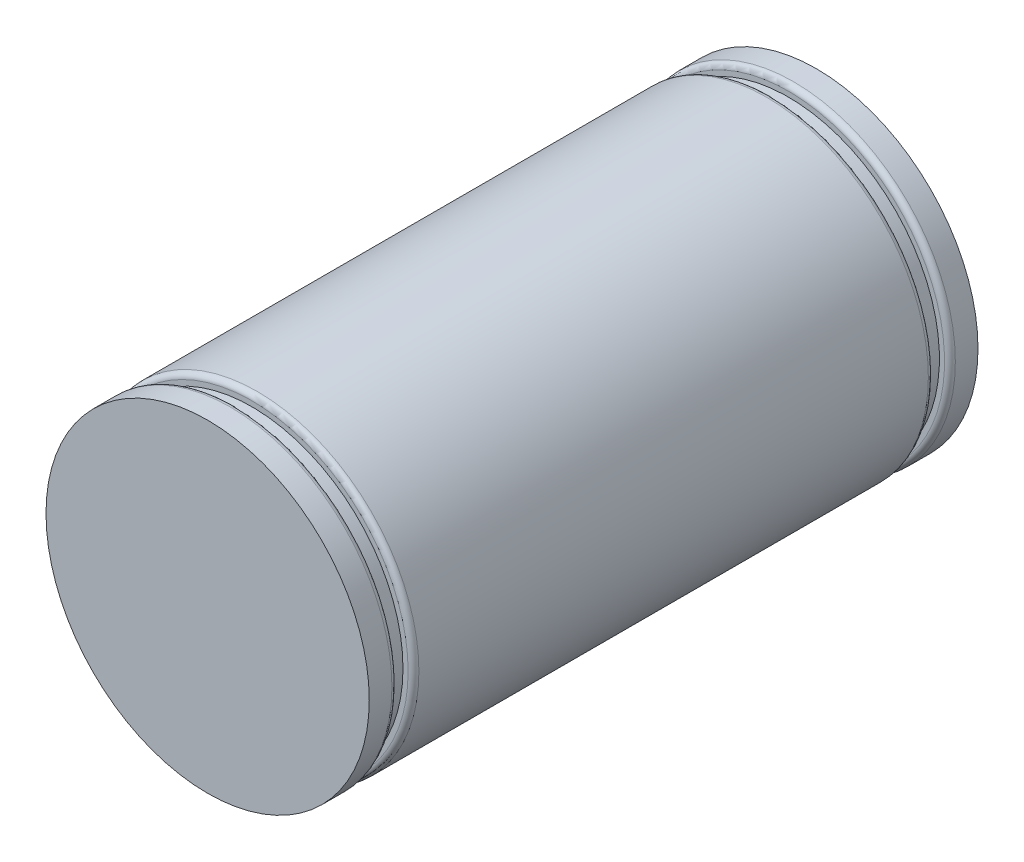
ISO-10303-21;
HEADER;
FILE_DESCRIPTION(('STEP AP214'),'2;1');
FILE_NAME('part.step','',(''),(''),'','','');
FILE_SCHEMA(('AUTOMOTIVE_DESIGN { 1 0 10303 214 1 1 1 1 }'));
ENDSEC;
DATA;
#1=APPLICATION_CONTEXT('core data for automotive mechanical design processes');
#2=APPLICATION_PROTOCOL_DEFINITION('international standard','automotive_design',2000,#1);
#3=PRODUCT_CONTEXT('',#1,'mechanical');
#4=PRODUCT('Part','Part','',(#3));
#5=PRODUCT_RELATED_PRODUCT_CATEGORY('part','',(#4));
#6=PRODUCT_DEFINITION_FORMATION('','',#4);
#7=PRODUCT_DEFINITION_CONTEXT('part definition',#1,'design');
#8=PRODUCT_DEFINITION('design','',#6,#7);
#9=PRODUCT_DEFINITION_SHAPE('','',#8);
#10=(LENGTH_UNIT() NAMED_UNIT(*) SI_UNIT(.MILLI.,.METRE.));
#11=(NAMED_UNIT(*) PLANE_ANGLE_UNIT() SI_UNIT($,.RADIAN.));
#12=(NAMED_UNIT(*) SI_UNIT($,.STERADIAN.) SOLID_ANGLE_UNIT());
#13=UNCERTAINTY_MEASURE_WITH_UNIT(LENGTH_MEASURE(1.E-05),#10,'distance_accuracy_value','');
#14=(GEOMETRIC_REPRESENTATION_CONTEXT(3) GLOBAL_UNCERTAINTY_ASSIGNED_CONTEXT((#13)) GLOBAL_UNIT_ASSIGNED_CONTEXT((#10,
#11,#12)) REPRESENTATION_CONTEXT('',''));
#15=CARTESIAN_POINT('',(0.,0.,0.));
#16=DIRECTION('',(0.,0.,1.));
#17=DIRECTION('',(1.,0.,0.));
#18=AXIS2_PLACEMENT_3D('',#15,#16,#17);
#19=CARTESIAN_POINT('',(0.,0.,-24.1));
#20=DIRECTION('',(0.,0.,1.));
#21=DIRECTION('',(1.,0.,0.));
#22=AXIS2_PLACEMENT_3D('',#19,#20,#21);
#23=CYLINDRICAL_SURFACE('',#22,14.975);
#24=CARTESIAN_POINT('',(0.,0.,-23.6));
#25=DIRECTION('',(0.,0.,1.));
#26=DIRECTION('',(1.,0.,0.));
#27=AXIS2_PLACEMENT_3D('',#24,#25,#26);
#28=CIRCLE('',#27,14.975);
#29=CARTESIAN_POINT('',(14.975,0.,-23.6));
#30=VERTEX_POINT('',#29);
#31=EDGE_CURVE('E48',#30,#30,#28,.T.);
#32=ORIENTED_EDGE('',*,*,#31,.T.);
#33=EDGE_LOOP('',(#32));
#34=FACE_BOUND('',#33,.T.);
#35=CARTESIAN_POINT('',(0.,0.,23.6));
#36=DIRECTION('',(0.,0.,1.));
#37=DIRECTION('',(1.,0.,0.));
#38=AXIS2_PLACEMENT_3D('',#35,#36,#37);
#39=CIRCLE('',#38,14.975);
#40=CARTESIAN_POINT('',(14.975,0.,23.6));
#41=VERTEX_POINT('',#40);
#42=EDGE_CURVE('E52',#41,#41,#39,.F.);
#43=ORIENTED_EDGE('',*,*,#42,.T.);
#44=EDGE_LOOP('',(#43));
#45=FACE_BOUND('',#44,.T.);
#46=ADVANCED_FACE('F37',(#34,#45),#23,.T.);
#47=CARTESIAN_POINT('',(0.,0.,-24.1));
#48=DIRECTION('',(0.,0.,1.));
#49=DIRECTION('',(1.,0.,0.));
#50=AXIS2_PLACEMENT_3D('',#47,#48,#49);
#51=PLANE('',#50);
#52=CARTESIAN_POINT('',(0.,0.,-24.1));
#53=DIRECTION('',(0.,0.,1.));
#54=DIRECTION('',(1.,0.,0.));
#55=AXIS2_PLACEMENT_3D('',#52,#53,#54);
#56=CIRCLE('',#55,14.475);
#57=CARTESIAN_POINT('',(14.475,0.,-24.1));
#58=VERTEX_POINT('',#57);
#59=EDGE_CURVE('E44',#58,#58,#56,.F.);
#60=ORIENTED_EDGE('',*,*,#59,.T.);
#61=EDGE_LOOP('',(#60));
#62=FACE_BOUND('',#61,.T.);
#63=CARTESIAN_POINT('',(0.,0.,-24.1));
#64=DIRECTION('',(0.,0.,-1.));
#65=DIRECTION('',(-1.,0.,0.));
#66=AXIS2_PLACEMENT_3D('',#63,#64,#65);
#67=CIRCLE('',#66,14.);
#68=CARTESIAN_POINT('',(-14.,0.,-24.1));
#69=VERTEX_POINT('',#68);
#70=EDGE_CURVE('E69',#69,#69,#67,.T.);
#71=ORIENTED_EDGE('',*,*,#70,.F.);
#72=EDGE_LOOP('',(#71));
#73=FACE_BOUND('',#72,.T.);
#74=ADVANCED_FACE('F108',(#62,#73),#51,.F.);
#75=CARTESIAN_POINT('',(0.,0.,24.1));
#76=DIRECTION('',(0.,0.,1.));
#77=DIRECTION('',(1.,0.,0.));
#78=AXIS2_PLACEMENT_3D('',#75,#76,#77);
#79=PLANE('',#78);
#80=CARTESIAN_POINT('',(0.,0.,24.1));
#81=DIRECTION('',(0.,0.,1.));
#82=DIRECTION('',(1.,0.,0.));
#83=AXIS2_PLACEMENT_3D('',#80,#81,#82);
#84=CIRCLE('',#83,14.475);
#85=CARTESIAN_POINT('',(14.475,0.,24.1));
#86=VERTEX_POINT('',#85);
#87=EDGE_CURVE('E10',#86,#86,#84,.T.);
#88=ORIENTED_EDGE('',*,*,#87,.T.);
#89=EDGE_LOOP('',(#88));
#90=FACE_BOUND('',#89,.T.);
#91=CARTESIAN_POINT('',(0.,0.,24.1));
#92=DIRECTION('',(0.,0.,1.));
#93=DIRECTION('',(1.,0.,0.));
#94=AXIS2_PLACEMENT_3D('',#91,#92,#93);
#95=CIRCLE('',#94,14.);
#96=CARTESIAN_POINT('',(14.,0.,24.1));
#97=VERTEX_POINT('',#96);
#98=EDGE_CURVE('E70',#97,#97,#95,.T.);
#99=ORIENTED_EDGE('',*,*,#98,.F.);
#100=EDGE_LOOP('',(#99));
#101=FACE_BOUND('',#100,.T.);
#102=ADVANCED_FACE('F115',(#90,#101),#79,.T.);
#103=CARTESIAN_POINT('',(0.,0.,25.6));
#104=DIRECTION('',(0.,0.,-1.));
#105=DIRECTION('',(-1.,0.,0.));
#106=AXIS2_PLACEMENT_3D('',#103,#104,#105);
#107=CYLINDRICAL_SURFACE('',#106,14.);
#108=CARTESIAN_POINT('',(0.,0.,25.6));
#109=DIRECTION('',(0.,0.,1.));
#110=DIRECTION('',(1.,0.,0.));
#111=AXIS2_PLACEMENT_3D('',#108,#109,#110);
#112=CIRCLE('',#111,14.);
#113=CARTESIAN_POINT('',(14.,0.,25.6));
#114=VERTEX_POINT('',#113);
#115=EDGE_CURVE('E73',#114,#114,#112,.T.);
#116=ORIENTED_EDGE('',*,*,#115,.F.);
#117=EDGE_LOOP('',(#116));
#118=FACE_BOUND('',#117,.T.);
#119=ORIENTED_EDGE('',*,*,#98,.T.);
#120=EDGE_LOOP('',(#119));
#121=FACE_BOUND('',#120,.T.);
#122=ADVANCED_FACE('F209',(#118,#121),#107,.T.);
#123=CARTESIAN_POINT('',(0.,0.,28.2));
#124=DIRECTION('',(0.,0.,-1.));
#125=DIRECTION('',(-1.,0.,0.));
#126=AXIS2_PLACEMENT_3D('',#123,#124,#125);
#127=CYLINDRICAL_SURFACE('',#126,14.975);
#128=CARTESIAN_POINT('',(0.,0.,26.1));
#129=DIRECTION('',(0.,0.,1.));
#130=DIRECTION('',(1.,0.,0.));
#131=AXIS2_PLACEMENT_3D('',#128,#129,#130);
#132=CIRCLE('',#131,14.975);
#133=CARTESIAN_POINT('',(14.975,0.,26.1));
#134=VERTEX_POINT('',#133);
#135=EDGE_CURVE('E66',#134,#134,#132,.T.);
#136=ORIENTED_EDGE('',*,*,#135,.T.);
#137=EDGE_LOOP('',(#136));
#138=FACE_BOUND('',#137,.T.);
#139=CARTESIAN_POINT('',(0.,0.,28.2));
#140=DIRECTION('',(0.,0.,1.));
#141=DIRECTION('',(1.,0.,0.));
#142=AXIS2_PLACEMENT_3D('',#139,#140,#141);
#143=CIRCLE('',#142,14.975);
#144=CARTESIAN_POINT('',(14.975,0.,28.2));
#145=VERTEX_POINT('',#144);
#146=EDGE_CURVE('E76',#145,#145,#143,.T.);
#147=ORIENTED_EDGE('',*,*,#146,.F.);
#148=EDGE_LOOP('',(#147));
#149=FACE_BOUND('',#148,.T.);
#150=ADVANCED_FACE('F199',(#138,#149),#127,.T.);
#151=CARTESIAN_POINT('',(0.,0.,28.2));
#152=DIRECTION('',(0.,0.,1.));
#153=DIRECTION('',(1.,0.,0.));
#154=AXIS2_PLACEMENT_3D('',#151,#152,#153);
#155=PLANE('',#154);
#156=ORIENTED_EDGE('',*,*,#146,.T.);
#157=EDGE_LOOP('',(#156));
#158=FACE_BOUND('',#157,.T.);
#159=ADVANCED_FACE('F190',(#158),#155,.T.);
#160=CARTESIAN_POINT('',(0.,0.,25.6));
#161=DIRECTION('',(0.,0.,1.));
#162=DIRECTION('',(1.,0.,0.));
#163=AXIS2_PLACEMENT_3D('',#160,#161,#162);
#164=PLANE('',#163);
#165=CARTESIAN_POINT('',(0.,0.,25.6));
#166=DIRECTION('',(0.,0.,1.));
#167=DIRECTION('',(1.,0.,0.));
#168=AXIS2_PLACEMENT_3D('',#165,#166,#167);
#169=CIRCLE('',#168,14.475);
#170=CARTESIAN_POINT('',(14.475,0.,25.6));
#171=VERTEX_POINT('',#170);
#172=EDGE_CURVE('E63',#171,#171,#169,.F.);
#173=ORIENTED_EDGE('',*,*,#172,.T.);
#174=EDGE_LOOP('',(#173));
#175=FACE_BOUND('',#174,.T.);
#176=ORIENTED_EDGE('',*,*,#115,.T.);
#177=EDGE_LOOP('',(#176));
#178=FACE_BOUND('',#177,.T.);
#179=ADVANCED_FACE('F103',(#175,#178),#164,.F.);
#180=CARTESIAN_POINT('',(0.,0.,-25.6));
#181=DIRECTION('',(0.,0.,1.));
#182=DIRECTION('',(1.,0.,0.));
#183=AXIS2_PLACEMENT_3D('',#180,#181,#182);
#184=CYLINDRICAL_SURFACE('',#183,14.);
#185=CARTESIAN_POINT('',(0.,0.,-25.6));
#186=DIRECTION('',(0.,0.,-1.));
#187=DIRECTION('',(-1.,0.,0.));
#188=AXIS2_PLACEMENT_3D('',#185,#186,#187);
#189=CIRCLE('',#188,14.);
#190=CARTESIAN_POINT('',(-14.,0.,-25.6));
#191=VERTEX_POINT('',#190);
#192=EDGE_CURVE('E79',#191,#191,#189,.T.);
#193=ORIENTED_EDGE('',*,*,#192,.F.);
#194=EDGE_LOOP('',(#193));
#195=FACE_BOUND('',#194,.T.);
#196=ORIENTED_EDGE('',*,*,#70,.T.);
#197=EDGE_LOOP('',(#196));
#198=FACE_BOUND('',#197,.T.);
#199=ADVANCED_FACE('F92',(#195,#198),#184,.T.);
#200=CARTESIAN_POINT('',(0.,0.,-28.2));
#201=DIRECTION('',(0.,0.,1.));
#202=DIRECTION('',(1.,0.,0.));
#203=AXIS2_PLACEMENT_3D('',#200,#201,#202);
#204=CYLINDRICAL_SURFACE('',#203,14.975);
#205=CARTESIAN_POINT('',(0.,0.,-26.1));
#206=DIRECTION('',(0.,0.,-1.));
#207=DIRECTION('',(-1.,0.,0.));
#208=AXIS2_PLACEMENT_3D('',#205,#206,#207);
#209=CIRCLE('',#208,14.975);
#210=CARTESIAN_POINT('',(-14.975,0.,-26.1));
#211=VERTEX_POINT('',#210);
#212=EDGE_CURVE('E60',#211,#211,#209,.T.);
#213=ORIENTED_EDGE('',*,*,#212,.T.);
#214=EDGE_LOOP('',(#213));
#215=FACE_BOUND('',#214,.T.);
#216=CARTESIAN_POINT('',(0.,0.,-28.2));
#217=DIRECTION('',(0.,0.,-1.));
#218=DIRECTION('',(-1.,0.,0.));
#219=AXIS2_PLACEMENT_3D('',#216,#217,#218);
#220=CIRCLE('',#219,14.975);
#221=CARTESIAN_POINT('',(-14.975,0.,-28.2));
#222=VERTEX_POINT('',#221);
#223=EDGE_CURVE('E84',#222,#222,#220,.T.);
#224=ORIENTED_EDGE('',*,*,#223,.F.);
#225=EDGE_LOOP('',(#224));
#226=FACE_BOUND('',#225,.T.);
#227=ADVANCED_FACE('F90',(#215,#226),#204,.T.);
#228=CARTESIAN_POINT('',(0.,0.,-28.2));
#229=DIRECTION('',(0.,0.,-1.));
#230=DIRECTION('',(-1.,0.,0.));
#231=AXIS2_PLACEMENT_3D('',#228,#229,#230);
#232=PLANE('',#231);
#233=ORIENTED_EDGE('',*,*,#223,.T.);
#234=EDGE_LOOP('',(#233));
#235=FACE_BOUND('',#234,.T.);
#236=ADVANCED_FACE('F88',(#235),#232,.T.);
#237=CARTESIAN_POINT('',(0.,0.,-25.6));
#238=DIRECTION('',(0.,0.,-1.));
#239=DIRECTION('',(-1.,0.,0.));
#240=AXIS2_PLACEMENT_3D('',#237,#238,#239);
#241=PLANE('',#240);
#242=CARTESIAN_POINT('',(0.,0.,-25.6));
#243=DIRECTION('',(0.,0.,-1.));
#244=DIRECTION('',(-1.,0.,0.));
#245=AXIS2_PLACEMENT_3D('',#242,#243,#244);
#246=CIRCLE('',#245,14.475);
#247=CARTESIAN_POINT('',(-14.475,0.,-25.6));
#248=VERTEX_POINT('',#247);
#249=EDGE_CURVE('E57',#248,#248,#246,.F.);
#250=ORIENTED_EDGE('',*,*,#249,.T.);
#251=EDGE_LOOP('',(#250));
#252=FACE_BOUND('',#251,.T.);
#253=ORIENTED_EDGE('',*,*,#192,.T.);
#254=EDGE_LOOP('',(#253));
#255=FACE_BOUND('',#254,.T.);
#256=ADVANCED_FACE('F100',(#252,#255),#241,.F.);
#257=CARTESIAN_POINT('',(0.,0.,26.1));
#258=DIRECTION('',(0.,0.,1.));
#259=DIRECTION('',(1.,0.,0.));
#260=AXIS2_PLACEMENT_3D('',#257,#258,#259);
#261=TOROIDAL_SURFACE('',#260,14.475,0.5);
#262=ORIENTED_EDGE('',*,*,#172,.F.);
#263=EDGE_LOOP('',(#262));
#264=FACE_BOUND('',#263,.T.);
#265=ORIENTED_EDGE('',*,*,#135,.F.);
#266=EDGE_LOOP('',(#265));
#267=FACE_BOUND('',#266,.T.);
#268=ADVANCED_FACE('F120',(#264,#267),#261,.T.);
#269=CARTESIAN_POINT('',(0.,0.,-26.1));
#270=DIRECTION('',(0.,0.,-1.));
#271=DIRECTION('',(-1.,0.,0.));
#272=AXIS2_PLACEMENT_3D('',#269,#270,#271);
#273=TOROIDAL_SURFACE('',#272,14.475,0.5);
#274=ORIENTED_EDGE('',*,*,#249,.F.);
#275=EDGE_LOOP('',(#274));
#276=FACE_BOUND('',#275,.T.);
#277=ORIENTED_EDGE('',*,*,#212,.F.);
#278=EDGE_LOOP('',(#277));
#279=FACE_BOUND('',#278,.T.);
#280=ADVANCED_FACE('F122',(#276,#279),#273,.T.);
#281=CARTESIAN_POINT('',(0.,0.,-23.6));
#282=DIRECTION('',(0.,0.,1.));
#283=DIRECTION('',(1.,0.,0.));
#284=AXIS2_PLACEMENT_3D('',#281,#282,#283);
#285=TOROIDAL_SURFACE('',#284,14.475,0.5);
#286=ORIENTED_EDGE('',*,*,#59,.F.);
#287=EDGE_LOOP('',(#286));
#288=FACE_BOUND('',#287,.T.);
#289=ORIENTED_EDGE('',*,*,#31,.F.);
#290=EDGE_LOOP('',(#289));
#291=FACE_BOUND('',#290,.T.);
#292=ADVANCED_FACE('F125',(#288,#291),#285,.T.);
#293=CARTESIAN_POINT('',(0.,0.,23.6));
#294=DIRECTION('',(0.,0.,1.));
#295=DIRECTION('',(1.,0.,0.));
#296=AXIS2_PLACEMENT_3D('',#293,#294,#295);
#297=TOROIDAL_SURFACE('',#296,14.475,0.5);
#298=ORIENTED_EDGE('',*,*,#42,.F.);
#299=EDGE_LOOP('',(#298));
#300=FACE_BOUND('',#299,.T.);
#301=ORIENTED_EDGE('',*,*,#87,.F.);
#302=EDGE_LOOP('',(#301));
#303=FACE_BOUND('',#302,.T.);
#304=ADVANCED_FACE('F39',(#300,#303),#297,.T.);
#305=CLOSED_SHELL('',(#46,#74,#102,#122,#150,#159,#179,#199,#227,#236,#256,#268,#280,#292,#304));
#306=MANIFOLD_SOLID_BREP('B2',#305);
#307=ADVANCED_BREP_SHAPE_REPRESENTATION('',(#18,#306),#14);
#308=SHAPE_DEFINITION_REPRESENTATION(#9,#307);
ENDSEC;
END-ISO-10303-21;
